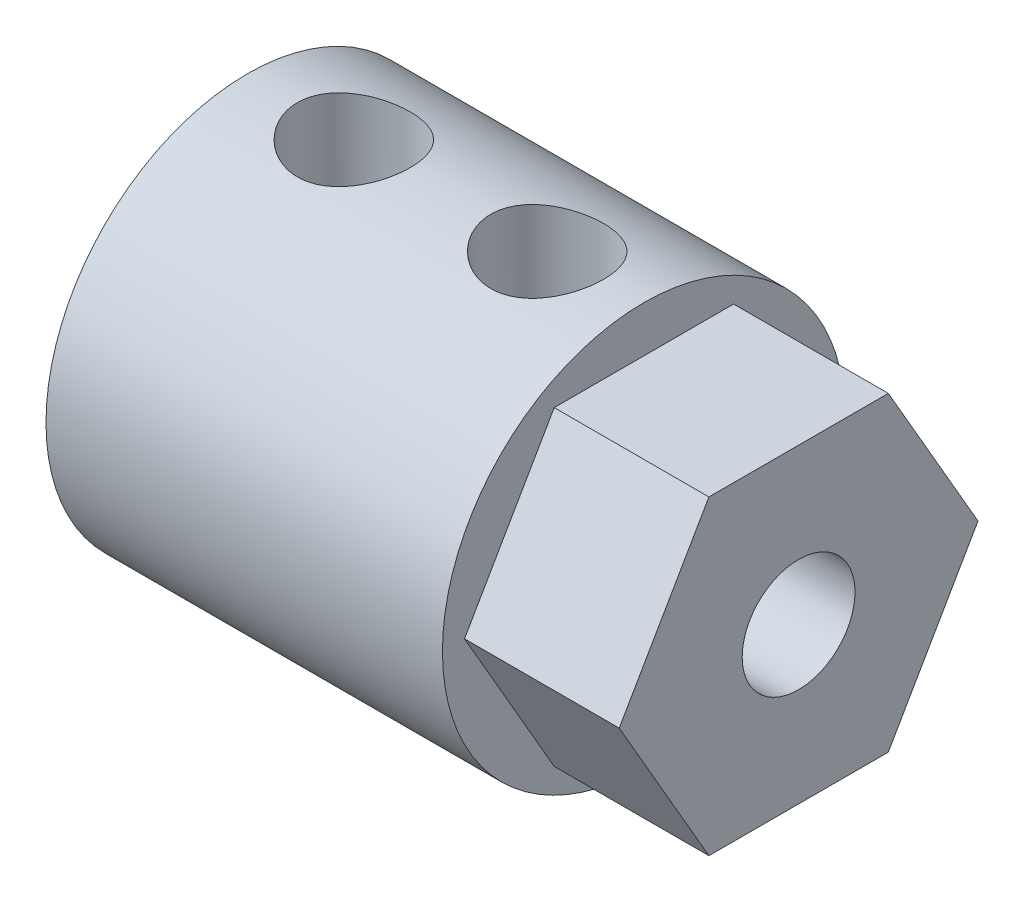
ISO-10303-21;
HEADER;
FILE_DESCRIPTION(('STEP AP214'),'2;1');
FILE_NAME('part.step','',(''),(''),'','','');
FILE_SCHEMA(('AUTOMOTIVE_DESIGN { 1 0 10303 214 1 1 1 1 }'));
ENDSEC;
DATA;
#1=APPLICATION_CONTEXT('core data for automotive mechanical design processes');
#2=APPLICATION_PROTOCOL_DEFINITION('international standard','automotive_design',2000,#1);
#3=PRODUCT_CONTEXT('',#1,'mechanical');
#4=PRODUCT('Part','Part','',(#3));
#5=PRODUCT_RELATED_PRODUCT_CATEGORY('part','',(#4));
#6=PRODUCT_DEFINITION_FORMATION('','',#4);
#7=PRODUCT_DEFINITION_CONTEXT('part definition',#1,'design');
#8=PRODUCT_DEFINITION('design','',#6,#7);
#9=PRODUCT_DEFINITION_SHAPE('','',#8);
#10=(LENGTH_UNIT() NAMED_UNIT(*) SI_UNIT(.MILLI.,.METRE.));
#11=(NAMED_UNIT(*) PLANE_ANGLE_UNIT() SI_UNIT($,.RADIAN.));
#12=(NAMED_UNIT(*) SI_UNIT($,.STERADIAN.) SOLID_ANGLE_UNIT());
#13=UNCERTAINTY_MEASURE_WITH_UNIT(LENGTH_MEASURE(1.E-05),#10,'distance_accuracy_value','');
#14=(GEOMETRIC_REPRESENTATION_CONTEXT(3) GLOBAL_UNCERTAINTY_ASSIGNED_CONTEXT((#13)) GLOBAL_UNIT_ASSIGNED_CONTEXT((#10,
#11,#12)) REPRESENTATION_CONTEXT('',''));
#15=CARTESIAN_POINT('',(0.,0.,0.));
#16=DIRECTION('',(0.,0.,1.));
#17=DIRECTION('',(1.,0.,0.));
#18=AXIS2_PLACEMENT_3D('',#15,#16,#17);
#19=CARTESIAN_POINT('',(-15.621,0.,0.));
#20=DIRECTION('',(1.,0.,0.));
#21=DIRECTION('',(0.,0.,-1.));
#22=AXIS2_PLACEMENT_3D('',#19,#20,#21);
#23=CYLINDRICAL_SURFACE('',#22,7.9375);
#24=CARTESIAN_POINT('',(-15.621,0.,0.));
#25=DIRECTION('',(-1.,0.,0.));
#26=DIRECTION('',(0.,0.,1.));
#27=AXIS2_PLACEMENT_3D('',#24,#25,#26);
#28=CIRCLE('',#27,7.9375);
#29=CARTESIAN_POINT('',(-15.621,0.,7.9375));
#30=VERTEX_POINT('',#29);
#31=EDGE_CURVE('E244',#30,#30,#28,.T.);
#32=ORIENTED_EDGE('',*,*,#31,.F.);
#33=EDGE_LOOP('',(#32));
#34=FACE_BOUND('',#33,.T.);
#35=CARTESIAN_POINT('',(0.,0.,0.));
#36=DIRECTION('',(-1.,0.,0.));
#37=DIRECTION('',(0.,0.,1.));
#38=AXIS2_PLACEMENT_3D('',#35,#36,#37);
#39=CIRCLE('',#38,7.9375);
#40=CARTESIAN_POINT('',(0.,0.,7.9375));
#41=VERTEX_POINT('',#40);
#42=EDGE_CURVE('E252',#41,#41,#39,.T.);
#43=ORIENTED_EDGE('',*,*,#42,.T.);
#44=EDGE_LOOP('',(#43));
#45=FACE_BOUND('',#44,.T.);
#46=CARTESIAN_POINT('',(-1.5875,7.9375,0.));
#47=CARTESIAN_POINT('',(-1.587502398111,7.93749841297143,-0.122289434384592));
#48=CARTESIAN_POINT('',(-1.59762687587564,7.93464640374844,-0.24460380457482));
#49=CARTESIAN_POINT('',(-1.63777621242458,7.92354674957216,-0.485694032880113));
#50=CARTESIAN_POINT('',(-1.66780922620723,7.91529689355351,-0.60446842009344));
#51=CARTESIAN_POINT('',(-1.74671141204331,7.89430957331477,-0.834964927090246));
#52=CARTESIAN_POINT('',(-1.79555492267656,7.88157822480584,-0.946696414251323));
#53=CARTESIAN_POINT('',(-1.91059251715217,7.85296472583047,-1.16038287672983));
#54=CARTESIAN_POINT('',(-1.97678821842334,7.83708228167832,-1.26233693946535));
#55=CARTESIAN_POINT('',(-2.12642117544705,7.8034232726709,-1.45615831068255));
#56=CARTESIAN_POINT('',(-2.21021716527189,7.78561177508401,-1.54774260219952));
#57=CARTESIAN_POINT('',(-2.39190611080195,7.75032012250063,-1.71575936348891));
#58=CARTESIAN_POINT('',(-2.48980108186053,7.73284001527906,-1.79218966338291));
#59=CARTESIAN_POINT('',(-2.69922041664797,7.6998283677456,-1.92915068426256));
#60=CARTESIAN_POINT('',(-2.81097026361879,7.68434065377252,-1.98934817384267));
#61=CARTESIAN_POINT('',(-3.04350943858364,7.65758432116579,-2.08998548271767));
#62=CARTESIAN_POINT('',(-3.16429690220516,7.64631483521622,-2.13042936410227));
#63=CARTESIAN_POINT('',(-3.4083305685353,7.62963290719132,-2.18941388458174));
#64=CARTESIAN_POINT('',(-3.53144225208111,7.62408261047198,-2.20847108866752));
#65=CARTESIAN_POINT('',(-3.77923081639445,7.61905627706929,-2.22575284029697));
#66=CARTESIAN_POINT('',(-3.90390736649889,7.61957897802232,-2.22398171731976));
#67=CARTESIAN_POINT('',(-4.14719088560424,7.62651666080719,-2.20006548936518));
#68=CARTESIAN_POINT('',(-4.26586618923935,7.63274845031214,-2.17855378119358));
#69=CARTESIAN_POINT('',(-4.49785161633767,7.65010764560777,-2.1167849227819));
#70=CARTESIAN_POINT('',(-4.61116127104343,7.66123547825911,-2.0765261380634));
#71=CARTESIAN_POINT('',(-4.83081036825138,7.68728817952527,-1.97790928071366));
#72=CARTESIAN_POINT('',(-4.93704749092035,7.7022578670799,-1.9193356539467));
#73=CARTESIAN_POINT('',(-5.13840348293651,7.73428447505437,-1.78590192518265));
#74=CARTESIAN_POINT('',(-5.23351995715069,7.75134184349961,-1.71103832459554));
#75=CARTESIAN_POINT('',(-5.41354369025916,7.78637689551321,-1.54394699344826));
#76=CARTESIAN_POINT('',(-5.49795804958312,7.80436556600566,-1.45118970763094));
#77=CARTESIAN_POINT('',(-5.6501397189066,7.83868636973626,-1.25261337987339));
#78=CARTESIAN_POINT('',(-5.71790623276662,7.85501842372916,-1.14679371362257));
#79=CARTESIAN_POINT('',(-5.83511680307549,7.88430398837012,-0.924282134935336));
#80=CARTESIAN_POINT('',(-5.88446390275543,7.89723951739796,-0.807536626467184));
#81=CARTESIAN_POINT('',(-5.96268456648585,7.91814489748872,-0.566959944436843));
#82=CARTESIAN_POINT('',(-5.99156307940385,7.92611594879985,-0.443130491451456));
#83=CARTESIAN_POINT('',(-6.02723492193407,7.93600949314591,-0.196101124919305));
#84=CARTESIAN_POINT('',(-6.03469753237385,7.93811522289107,-0.0730050493447829));
#85=CARTESIAN_POINT('',(-6.02918471081962,7.93657184147866,0.172682576611987));
#86=CARTESIAN_POINT('',(-6.01621162593874,7.9329233912093,0.295274183312975));
#87=CARTESIAN_POINT('',(-5.97074190820065,7.92040063357283,0.534031051075131));
#88=CARTESIAN_POINT('',(-5.93862546036324,7.91162815516481,0.650274552968655));
#89=CARTESIAN_POINT('',(-5.85622831272659,7.88985924413703,0.875707417570524));
#90=CARTESIAN_POINT('',(-5.80594554945293,7.87686233168934,0.984895977260915));
#91=CARTESIAN_POINT('',(-5.68744786332019,7.84766549897653,1.19566699168485));
#92=CARTESIAN_POINT('',(-5.61887794200882,7.83140394678713,1.29704110514929));
#93=CARTESIAN_POINT('',(-5.46619270156045,7.79755361828553,1.48707642789286));
#94=CARTESIAN_POINT('',(-5.38207398796685,7.77996455266095,1.57573485369032));
#95=CARTESIAN_POINT('',(-5.19754542583976,7.74475574438945,1.74069277960931));
#96=CARTESIAN_POINT('',(-5.09670785802765,7.72715229446269,1.81651823498446));
#97=CARTESIAN_POINT('',(-4.88336192472095,7.69450550823917,1.95019062299679));
#98=CARTESIAN_POINT('',(-4.77085399552126,7.67946207629195,2.00803822741068));
#99=CARTESIAN_POINT('',(-4.53786166057827,7.65381415280244,2.10368464486661));
#100=CARTESIAN_POINT('',(-4.41742523518426,7.64318537493625,2.14159346282923));
#101=CARTESIAN_POINT('',(-4.17153384499789,7.62758676285093,2.19651019045085));
#102=CARTESIAN_POINT('',(-4.04608033702155,7.62261529808532,2.21352412253003));
#103=CARTESIAN_POINT('',(-3.79859578431933,7.61904009677965,2.22579634337424));
#104=CARTESIAN_POINT('',(-3.67660541699017,7.62021218162667,2.22182051126848));
#105=CARTESIAN_POINT('',(-3.43510880845293,7.6282616577072,2.19402262129698));
#106=CARTESIAN_POINT('',(-3.31560249051765,7.63513887245171,2.17020117735789));
#107=CARTESIAN_POINT('',(-3.08354127422839,7.65368348699787,2.10385266467513));
#108=CARTESIAN_POINT('',(-2.9709315866381,7.66530524566887,2.06150355593924));
#109=CARTESIAN_POINT('',(-2.75432773685296,7.69202662666681,1.95943946415649));
#110=CARTESIAN_POINT('',(-2.65033505215382,7.70712684374916,1.89972151088259));
#111=CARTESIAN_POINT('',(-2.45030033200027,7.73971061356866,1.76236009307517));
#112=CARTESIAN_POINT('',(-2.35462190181763,7.75725523110183,1.68420156559259));
#113=CARTESIAN_POINT('',(-2.17749007152221,7.79242812441293,1.51313678633054));
#114=CARTESIAN_POINT('',(-2.09604021868082,7.81005641993032,1.42022686792809));
#115=CARTESIAN_POINT('',(-1.9477194350652,7.84392363107764,1.21957214778867));
#116=CARTESIAN_POINT('',(-1.88125116374675,7.86011833953724,1.11152155583987));
#117=CARTESIAN_POINT('',(-1.76752470486395,7.88879340490492,0.885326940704654));
#118=CARTESIAN_POINT('',(-1.72025544990178,7.90127590062755,0.767188780236336));
#119=CARTESIAN_POINT('',(-1.65169956819758,7.91970568495603,0.541420338472193));
#120=CARTESIAN_POINT('',(-1.62768411699767,7.92632747266372,0.43466625717126));
#121=CARTESIAN_POINT('',(-1.59558423476692,7.93522507389311,0.218614550898743));
#122=CARTESIAN_POINT('',(-1.58749785627538,7.93750141868005,0.109317238511546));
#123=CARTESIAN_POINT('',(-1.5875,7.9375,0.));
#124=B_SPLINE_CURVE_WITH_KNOTS('',3,(#46,#47,#48,#49,#50,#51,#52,#53,#54,#55,#56,#57,#58,#59,
#60,#61,#62,#63,#64,#65,#66,#67,#68,#69,#70,#71,#72,#73,#74,#75,#76,#77,#78,#79,#80,#81,#82,#83,
#84,#85,#86,#87,#88,#89,#90,#91,#92,#93,#94,#95,#96,#97,#98,#99,#100,#101,#102,#103,#104,#105,
#106,#107,#108,#109,#110,#111,#112,#113,#114,#115,#116,#117,#118,#119,#120,#121,#122,#123),
.UNSPECIFIED.,.T.,.F.,(4,2,2,2,2,2,2,2,2,2,2,2,2,2,2,2,2,2,2,2,2,2,2,2,2,2,2,2,2,2,2,2,2,2,2,2,
2,2,4),(0.,0.366467159375124,0.733084525040348,1.09920351015625,1.46535663402202,
1.83985902232483,2.2144149964241,2.59615815397004,2.97782277758453,3.35005588802573,
3.72221162561857,4.08282869463252,4.44347721021375,4.80854112418707,5.1736835202881,
5.55201589839114,5.93036636572644,6.310681224658,6.69090410017637,7.05910769208849,
7.42726899757706,7.78835148351941,8.14947499698045,8.51819575160419,8.88699709692384,
9.26734918477582,9.64768705833693,10.0259039435842,10.4040117918163,10.7684207028235,
11.1328183412108,11.4937902180729,11.8548238606708,12.2274771315308,12.6002231749544,
12.9820329052775,13.3636222254502,13.6912554080105,14.0188485322216),.UNSPECIFIED.);
#125=CARTESIAN_POINT('',(-1.5875,7.9375,0.));
#126=VERTEX_POINT('',#125);
#127=EDGE_CURVE('E154',#126,#126,#124,.T.);
#128=ORIENTED_EDGE('',*,*,#127,.F.);
#129=EDGE_LOOP('',(#128));
#130=FACE_BOUND('',#129,.T.);
#131=CARTESIAN_POINT('',(-9.2075,7.9375,0.));
#132=CARTESIAN_POINT('',(-9.207502398111,7.93749841297143,-0.122289434384593));
#133=CARTESIAN_POINT('',(-9.21762687587564,7.93464640374844,-0.24460380457482));
#134=CARTESIAN_POINT('',(-9.25777621242458,7.92354674957216,-0.485694032880113));
#135=CARTESIAN_POINT('',(-9.28780922620723,7.91529689355351,-0.60446842009344));
#136=CARTESIAN_POINT('',(-9.36671141204331,7.89430957331477,-0.834964927090245));
#137=CARTESIAN_POINT('',(-9.41555492267656,7.88157822480584,-0.946696414251323));
#138=CARTESIAN_POINT('',(-9.53059251715217,7.85296472583047,-1.16038287672983));
#139=CARTESIAN_POINT('',(-9.59678821842334,7.83708228167832,-1.26233693946535));
#140=CARTESIAN_POINT('',(-9.74642117544705,7.8034232726709,-1.45615831068255));
#141=CARTESIAN_POINT('',(-9.83021716527189,7.78561177508401,-1.54774260219952));
#142=CARTESIAN_POINT('',(-10.0119061108019,7.75032012250063,-1.7157593634889));
#143=CARTESIAN_POINT('',(-10.1098010818605,7.73284001527906,-1.79218966338291));
#144=CARTESIAN_POINT('',(-10.319220416648,7.6998283677456,-1.92915068426256));
#145=CARTESIAN_POINT('',(-10.4309702636188,7.68434065377252,-1.98934817384266));
#146=CARTESIAN_POINT('',(-10.6635094385836,7.65758432116579,-2.08998548271767));
#147=CARTESIAN_POINT('',(-10.7842969022052,7.64631483521622,-2.13042936410227));
#148=CARTESIAN_POINT('',(-11.0283305685353,7.62963290719132,-2.18941388458174));
#149=CARTESIAN_POINT('',(-11.1514422520811,7.62408261047198,-2.20847108866752));
#150=CARTESIAN_POINT('',(-11.3992308163944,7.61905627706929,-2.22575284029697));
#151=CARTESIAN_POINT('',(-11.5239073664989,7.61957897802232,-2.22398171731976));
#152=CARTESIAN_POINT('',(-11.7671908856042,7.62651666080719,-2.20006548936518));
#153=CARTESIAN_POINT('',(-11.8858661892394,7.63274845031214,-2.17855378119358));
#154=CARTESIAN_POINT('',(-12.1178516163377,7.65010764560777,-2.1167849227819));
#155=CARTESIAN_POINT('',(-12.2311612710434,7.66123547825911,-2.0765261380634));
#156=CARTESIAN_POINT('',(-12.4508103682514,7.68728817952527,-1.97790928071366));
#157=CARTESIAN_POINT('',(-12.5570474909203,7.7022578670799,-1.9193356539467));
#158=CARTESIAN_POINT('',(-12.7584034829365,7.73428447505437,-1.78590192518265));
#159=CARTESIAN_POINT('',(-12.8535199571507,7.75134184349961,-1.71103832459554));
#160=CARTESIAN_POINT('',(-13.0335436902592,7.78637689551321,-1.54394699344827));
#161=CARTESIAN_POINT('',(-13.1179580495831,7.80436556600566,-1.45118970763094));
#162=CARTESIAN_POINT('',(-13.2701397189066,7.83868636973626,-1.25261337987339));
#163=CARTESIAN_POINT('',(-13.3379062327666,7.85501842372916,-1.14679371362257));
#164=CARTESIAN_POINT('',(-13.4551168030755,7.88430398837012,-0.924282134935336));
#165=CARTESIAN_POINT('',(-13.5044639027554,7.89723951739796,-0.807536626467184));
#166=CARTESIAN_POINT('',(-13.5826845664859,7.91814489748872,-0.566959944436844));
#167=CARTESIAN_POINT('',(-13.6115630794039,7.92611594879985,-0.443130491451456));
#168=CARTESIAN_POINT('',(-13.6472349219341,7.93600949314591,-0.196101124919305));
#169=CARTESIAN_POINT('',(-13.6546975323738,7.93811522289107,-0.0730050493447832));
#170=CARTESIAN_POINT('',(-13.6491847108196,7.93657184147866,0.172682576611986));
#171=CARTESIAN_POINT('',(-13.6362116259387,7.9329233912093,0.295274183312975));
#172=CARTESIAN_POINT('',(-13.5907419082007,7.92040063357283,0.534031051075131));
#173=CARTESIAN_POINT('',(-13.5586254603632,7.91162815516481,0.650274552968655));
#174=CARTESIAN_POINT('',(-13.4762283127266,7.88985924413703,0.875707417570524));
#175=CARTESIAN_POINT('',(-13.4259455494529,7.87686233168934,0.984895977260914));
#176=CARTESIAN_POINT('',(-13.3074478633202,7.84766549897653,1.19566699168485));
#177=CARTESIAN_POINT('',(-13.2388779420088,7.83140394678713,1.29704110514929));
#178=CARTESIAN_POINT('',(-13.0861927015605,7.79755361828553,1.48707642789286));
#179=CARTESIAN_POINT('',(-13.0020739879669,7.77996455266095,1.57573485369032));
#180=CARTESIAN_POINT('',(-12.8175454258398,7.74475574438945,1.74069277960931));
#181=CARTESIAN_POINT('',(-12.7167078580276,7.72715229446269,1.81651823498446));
#182=CARTESIAN_POINT('',(-12.5033619247209,7.69450550823917,1.95019062299679));
#183=CARTESIAN_POINT('',(-12.3908539955213,7.67946207629195,2.00803822741068));
#184=CARTESIAN_POINT('',(-12.1578616605783,7.65381415280244,2.10368464486661));
#185=CARTESIAN_POINT('',(-12.0374252351843,7.64318537493625,2.14159346282923));
#186=CARTESIAN_POINT('',(-11.7915338449979,7.62758676285093,2.19651019045085));
#187=CARTESIAN_POINT('',(-11.6660803370216,7.62261529808532,2.21352412253003));
#188=CARTESIAN_POINT('',(-11.4185957843193,7.61904009677965,2.22579634337424));
#189=CARTESIAN_POINT('',(-11.2966054169902,7.62021218162667,2.22182051126848));
#190=CARTESIAN_POINT('',(-11.0551088084529,7.6282616577072,2.19402262129698));
#191=CARTESIAN_POINT('',(-10.9356024905177,7.63513887245171,2.17020117735789));
#192=CARTESIAN_POINT('',(-10.7035412742284,7.65368348699787,2.10385266467513));
#193=CARTESIAN_POINT('',(-10.5909315866381,7.66530524566887,2.06150355593924));
#194=CARTESIAN_POINT('',(-10.374327736853,7.69202662666681,1.95943946415649));
#195=CARTESIAN_POINT('',(-10.2703350521538,7.70712684374916,1.89972151088259));
#196=CARTESIAN_POINT('',(-10.0703003320003,7.73971061356866,1.76236009307517));
#197=CARTESIAN_POINT('',(-9.97462190181763,7.75725523110183,1.68420156559259));
#198=CARTESIAN_POINT('',(-9.79749007152221,7.79242812441293,1.51313678633054));
#199=CARTESIAN_POINT('',(-9.71604021868082,7.81005641993032,1.42022686792809));
#200=CARTESIAN_POINT('',(-9.5677194350652,7.84392363107764,1.21957214778867));
#201=CARTESIAN_POINT('',(-9.50125116374675,7.86011833953724,1.11152155583987));
#202=CARTESIAN_POINT('',(-9.38752470486395,7.88879340490492,0.885326940704655));
#203=CARTESIAN_POINT('',(-9.34025544990178,7.90127590062755,0.767188780236337));
#204=CARTESIAN_POINT('',(-9.27169956819758,7.91970568495603,0.541420338472194));
#205=CARTESIAN_POINT('',(-9.24768411699767,7.92632747266372,0.434666257171261));
#206=CARTESIAN_POINT('',(-9.21558423476692,7.93522507389311,0.218614550898744));
#207=CARTESIAN_POINT('',(-9.20749785627538,7.93750141868005,0.109317238511547));
#208=CARTESIAN_POINT('',(-9.2075,7.9375,0.));
#209=B_SPLINE_CURVE_WITH_KNOTS('',3,(#131,#132,#133,#134,#135,#136,#137,#138,#139,#140,#141,
#142,#143,#144,#145,#146,#147,#148,#149,#150,#151,#152,#153,#154,#155,#156,#157,#158,#159,#160,
#161,#162,#163,#164,#165,#166,#167,#168,#169,#170,#171,#172,#173,#174,#175,#176,#177,#178,#179,
#180,#181,#182,#183,#184,#185,#186,#187,#188,#189,#190,#191,#192,#193,#194,#195,#196,#197,#198,
#199,#200,#201,#202,#203,#204,#205,#206,#207,#208),.UNSPECIFIED.,.T.,.F.,(4,2,2,2,2,2,2,2,2,2,2,
2,2,2,2,2,2,2,2,2,2,2,2,2,2,2,2,2,2,2,2,2,2,2,2,2,2,2,4),(0.,0.366467159375124,
0.733084525040348,1.09920351015625,1.46535663402202,1.83985902232483,2.2144149964241,
2.59615815397004,2.97782277758453,3.35005588802573,3.72221162561857,4.08282869463252,
4.44347721021375,4.80854112418707,5.1736835202881,5.55201589839114,5.93036636572644,
6.310681224658,6.69090410017637,7.05910769208849,7.42726899757706,7.78835148351941,
8.14947499698045,8.51819575160419,8.88699709692384,9.26734918477582,9.64768705833692,
10.0259039435842,10.4040117918163,10.7684207028235,11.1328183412108,11.4937902180729,
11.8548238606708,12.2274771315308,12.6002231749544,12.9820329052775,13.3636222254502,
13.6912554080105,14.0188485322216),.UNSPECIFIED.);
#210=CARTESIAN_POINT('',(-9.2075,7.9375,0.));
#211=VERTEX_POINT('',#210);
#212=EDGE_CURVE('E179',#211,#211,#209,.T.);
#213=ORIENTED_EDGE('',*,*,#212,.F.);
#214=EDGE_LOOP('',(#213));
#215=FACE_BOUND('',#214,.T.);
#216=ADVANCED_FACE('F47',(#34,#45,#130,#215),#23,.T.);
#217=CARTESIAN_POINT('',(-15.621,0.,0.));
#218=DIRECTION('',(1.,0.,0.));
#219=DIRECTION('',(0.,0.,-1.));
#220=AXIS2_PLACEMENT_3D('',#217,#218,#219);
#221=CYLINDRICAL_SURFACE('',#220,3.2639);
#222=CARTESIAN_POINT('',(-3.81,2.39030060034298,-2.2225));
#223=CARTESIAN_POINT('',(-3.86387681861353,2.39029751716212,-2.22250164306595));
#224=CARTESIAN_POINT('',(-3.91773845668203,2.39213071298594,-2.22053678683314));
#225=CARTESIAN_POINT('',(-4.02494702809361,2.39934857483477,-2.21273503878008));
#226=CARTESIAN_POINT('',(-4.07829381339239,2.4047342332002,-2.2068970650454));
#227=CARTESIAN_POINT('',(-4.23699002756019,2.42588326346957,-2.18371102633077));
#228=CARTESIAN_POINT('',(-4.34090732766237,2.44663804441049,-2.16069112531605));
#229=CARTESIAN_POINT('',(-4.5409605126561,2.49769801818942,-2.1014344738383));
#230=CARTESIAN_POINT('',(-4.63716510134079,2.52790338207168,-2.06533528073356));
#231=CARTESIAN_POINT('',(-4.82199185747863,2.59426863384097,-1.98133330962816));
#232=CARTESIAN_POINT('',(-4.91061293079026,2.63042937877029,-1.93342883222908));
#233=CARTESIAN_POINT('',(-5.09362032816993,2.71171973668246,-1.81806779220596));
#234=CARTESIAN_POINT('',(-5.18657569992676,2.75734854327609,-1.74869430189853));
#235=CARTESIAN_POINT('',(-5.3607914885878,2.84832951759792,-1.59623415100642));
#236=CARTESIAN_POINT('',(-5.44203851577277,2.89368131268224,-1.5131320196709));
#237=CARTESIAN_POINT('',(-5.60295900772415,2.98719173096089,-1.32019416449024));
#238=CARTESIAN_POINT('',(-5.68046893060544,3.03470940930687,-1.2082125628379));
#239=CARTESIAN_POINT('',(-5.81482049963141,3.11931496425914,-0.968977638102178));
#240=CARTESIAN_POINT('',(-5.87170082899154,3.15642233165939,-0.841753499280781));
#241=CARTESIAN_POINT('',(-5.94968186708383,3.20798497031896,-0.610037351910737));
#242=CARTESIAN_POINT('',(-5.97622201597288,3.22581145431039,-0.508112525674404));
#243=CARTESIAN_POINT('',(-6.01463822381124,3.25173183658252,-0.30034638065822));
#244=CARTESIAN_POINT('',(-6.0265255990578,3.2598332453858,-0.194508149342579));
#245=CARTESIAN_POINT('',(-6.03497838669641,3.26558670252435,0.0182487258031895));
#246=CARTESIAN_POINT('',(-6.03151751530509,3.26322082571014,0.125168909922686));
#247=CARTESIAN_POINT('',(-6.00942165359198,3.24821918218687,0.336698894486105));
#248=CARTESIAN_POINT('',(-5.99078222924205,3.23558041451607,0.44130801063722));
#249=CARTESIAN_POINT('',(-5.9398295096798,3.20146247619827,0.643429241760701));
#250=CARTESIAN_POINT('',(-5.90777927436546,3.18015358541928,0.741037675775122));
#251=CARTESIAN_POINT('',(-5.83143327006727,3.13031864942995,0.929325463827257));
#252=CARTESIAN_POINT('',(-5.78713517056554,3.10179123076919,1.02000349495551));
#253=CARTESIAN_POINT('',(-5.68210832485672,3.03586328663528,1.20293986056559));
#254=CARTESIAN_POINT('',(-5.62009047445614,2.99782509199416,1.29422452830014));
#255=CARTESIAN_POINT('',(-5.4842734004816,2.91782698130799,1.46570906304054));
#256=CARTESIAN_POINT('',(-5.41046064806107,2.87586258507,1.54589600135202));
#257=CARTESIAN_POINT('',(-5.23880503297432,2.78368336992229,1.70709018645584));
#258=CARTESIAN_POINT('',(-5.13901027469807,2.73327894501512,1.78591862722644));
#259=CARTESIAN_POINT('',(-4.92610956542356,2.63633546062852,1.92614467823464));
#260=CARTESIAN_POINT('',(-4.8130105732286,2.58979440194658,1.98755134411938));
#261=CARTESIAN_POINT('',(-4.60287409551625,2.51692976605818,2.07862319301861));
#262=CARTESIAN_POINT('',(-4.50836901885494,2.48842814486749,2.11236098791731));
#263=CARTESIAN_POINT('',(-4.31350321206215,2.44093738649646,2.16706984520766));
#264=CARTESIAN_POINT('',(-4.21315361484031,2.4219307843843,2.18806436272226));
#265=CARTESIAN_POINT('',(-4.00800115894879,2.39631941762942,2.21609711209024));
#266=CARTESIAN_POINT('',(-3.90316802929383,2.38981991348072,2.22301691777719));
#267=CARTESIAN_POINT('',(-3.69364554010754,2.39083751520441,2.22192260819448));
#268=CARTESIAN_POINT('',(-3.58895617793243,2.39835435977746,2.21390877132478));
#269=CARTESIAN_POINT('',(-3.39534714993433,2.42431464368734,2.18541503596635));
#270=CARTESIAN_POINT('',(-3.30600055922041,2.44139896573962,2.16647827759457));
#271=CARTESIAN_POINT('',(-3.13193124323293,2.48317543867991,2.11846510552193));
#272=CARTESIAN_POINT('',(-3.04721291860546,2.50787468672347,2.08937922943731));
#273=CARTESIAN_POINT('',(-2.84602577341292,2.5748995454653,2.00671051110969));
#274=CARTESIAN_POINT('',(-2.73262986598745,2.62013386390762,1.94800221309072));
#275=CARTESIAN_POINT('',(-2.51865038105588,2.71512442704127,1.81327308538944));
#276=CARTESIAN_POINT('',(-2.41809125671433,2.76488900163698,1.7372199605789));
#277=CARTESIAN_POINT('',(-2.22960819170821,2.86438428060038,1.56784544891095));
#278=CARTESIAN_POINT('',(-2.14188732809697,2.91410415173744,1.47429089917192));
#279=CARTESIAN_POINT('',(-1.98284649256078,3.00797601331659,1.27182262198244));
#280=CARTESIAN_POINT('',(-1.91150080442577,3.05213668420089,1.16293341673665));
#281=CARTESIAN_POINT('',(-1.79870992576815,3.12366488597408,0.951800831739676));
#282=CARTESIAN_POINT('',(-1.75421733057617,3.1526187359081,0.851727756736225));
#283=CARTESIAN_POINT('',(-1.68004093773573,3.20148086126667,0.644130252923867));
#284=CARTESIAN_POINT('',(-1.65034767665006,3.22139491646099,0.53661063604242));
#285=CARTESIAN_POINT('',(-1.60725477041928,3.25044100717349,0.316332971593631));
#286=CARTESIAN_POINT('',(-1.5939353468613,3.25951995112598,0.203551920591964));
#287=CARTESIAN_POINT('',(-1.58473117240477,3.26578394435276,-0.0230473007282234));
#288=CARTESIAN_POINT('',(-1.5888424303553,3.26297171638166,-0.136865227675214));
#289=CARTESIAN_POINT('',(-1.61315228406288,3.24647655831156,-0.352356081485915));
#290=CARTESIAN_POINT('',(-1.63199964641102,3.23370692855918,-0.45425785621263));
#291=CARTESIAN_POINT('',(-1.68313948316801,3.19948628740756,-0.653080343731994));
#292=CARTESIAN_POINT('',(-1.71543474132803,3.17803347859227,-0.750000020547386));
#293=CARTESIAN_POINT('',(-1.79400328334478,3.12679526171725,-0.9415468883208));
#294=CARTESIAN_POINT('',(-1.84088824978863,3.09665058725049,-1.03582433338721));
#295=CARTESIAN_POINT('',(-1.94634087831189,3.0306881826343,-1.2153736697172));
#296=CARTESIAN_POINT('',(-2.00491141445185,2.99486905730355,-1.30064333761535));
#297=CARTESIAN_POINT('',(-2.14242220796437,2.91389475700256,-1.47404175906904));
#298=CARTESIAN_POINT('',(-2.22311796319132,2.86815787793437,-1.56050331391021));
#299=CARTESIAN_POINT('',(-2.39706599510535,2.77569222982111,-1.71960778163205));
#300=CARTESIAN_POINT('',(-2.49034607990893,2.72896146285769,-1.79221920625993));
#301=CARTESIAN_POINT('',(-2.64543245235382,2.65843375448745,-1.89414779256364));
#302=CARTESIAN_POINT('',(-2.70338861081746,2.63346416446701,-1.92860177819981));
#303=CARTESIAN_POINT('',(-2.82288433259694,2.58552432263349,-1.99240982757592));
#304=CARTESIAN_POINT('',(-2.88442493443367,2.5625546551155,-2.02176240337211));
#305=CARTESIAN_POINT('',(-3.01063249425583,2.51972580178605,-2.07489455039068));
#306=CARTESIAN_POINT('',(-3.07528731929103,2.49985564954387,-2.09869392488008));
#307=CARTESIAN_POINT('',(-3.20752239176595,2.46423799418168,-2.14040351899111));
#308=CARTESIAN_POINT('',(-3.27509996719961,2.44848681456931,-2.15831899411596));
#309=CARTESIAN_POINT('',(-3.41955893246682,2.42084169414365,-2.18930308664168));
#310=CARTESIAN_POINT('',(-3.49669293452559,2.40949428441096,-2.20170389939372));
#311=CARTESIAN_POINT('',(-3.65256269209018,2.39422803151017,-2.21829890001868));
#312=CARTESIAN_POINT('',(-3.73129754287663,2.39030510420782,-2.22249759983364));
#313=CARTESIAN_POINT('',(-3.81,2.39030060034298,-2.2225));
#314=B_SPLINE_CURVE_WITH_KNOTS('',3,(#222,#223,#224,#225,#226,#227,#228,#229,#230,#231,#232,
#233,#234,#235,#236,#237,#238,#239,#240,#241,#242,#243,#244,#245,#246,#247,#248,#249,#250,#251,
#252,#253,#254,#255,#256,#257,#258,#259,#260,#261,#262,#263,#264,#265,#266,#267,#268,#269,#270,
#271,#272,#273,#274,#275,#276,#277,#278,#279,#280,#281,#282,#283,#284,#285,#286,#287,#288,#289,
#290,#291,#292,#293,#294,#295,#296,#297,#298,#299,#300,#301,#302,#303,#304,#305,#306,#307,#308,
#309,#310,#311,#312,#313),.UNSPECIFIED.,.T.,.F.,(4,2,2,2,2,2,2,2,2,2,2,2,2,2,2,2,2,2,2,2,2,2,2,
2,2,2,2,2,2,2,2,2,2,2,2,2,2,2,2,2,2,2,2,2,2,4),(0.,0.161533348948191,0.323111839539057,
0.646528362355942,0.966637754458413,1.28679325400589,1.65935660879822,2.03234270402694,
2.46268949816965,2.89222511133065,3.21130654066329,3.53014138956571,3.84952245193868,
4.16899684684796,4.48247838740756,4.79601961818765,5.14489759350476,5.49417864560801,
5.90284878139955,6.31130610412828,6.62310792785091,6.93433409872721,7.24816830500536,
7.56199666069789,7.83965668809895,8.11757628258677,8.52183015265019,8.92684295725393,
9.33769520708225,9.74789775517685,10.0863332118707,10.4245519773946,10.7644212834151,
11.1042127728326,11.4160516092429,11.7279550292592,12.0552659049741,12.3826573821097,
12.7616441620906,13.141482557887,13.3569334403355,13.5724470589203,13.7871799698808,
14.001720556292,14.2378159869043,14.4737815059671),.UNSPECIFIED.);
#315=CARTESIAN_POINT('',(-3.81,2.39030060034298,-2.2225));
#316=VERTEX_POINT('',#315);
#317=EDGE_CURVE('E147',#316,#316,#314,.T.);
#318=ORIENTED_EDGE('',*,*,#317,.T.);
#319=EDGE_LOOP('',(#318));
#320=FACE_BOUND('',#319,.T.);
#321=CARTESIAN_POINT('',(-15.621,0.,0.));
#322=DIRECTION('',(-1.,0.,0.));
#323=DIRECTION('',(0.,0.,1.));
#324=AXIS2_PLACEMENT_3D('',#321,#322,#323);
#325=CIRCLE('',#324,3.2639);
#326=CARTESIAN_POINT('',(-15.621,0.,3.2639));
#327=VERTEX_POINT('',#326);
#328=EDGE_CURVE('E256',#327,#327,#325,.T.);
#329=ORIENTED_EDGE('',*,*,#328,.T.);
#330=EDGE_LOOP('',(#329));
#331=FACE_BOUND('',#330,.T.);
#332=CARTESIAN_POINT('',(0.,0.,0.));
#333=DIRECTION('',(-1.,0.,0.));
#334=DIRECTION('',(0.,0.,1.));
#335=AXIS2_PLACEMENT_3D('',#332,#333,#334);
#336=CIRCLE('',#335,3.2639);
#337=CARTESIAN_POINT('',(0.,0.,3.2639));
#338=VERTEX_POINT('',#337);
#339=EDGE_CURVE('E11',#338,#338,#336,.F.);
#340=ORIENTED_EDGE('',*,*,#339,.T.);
#341=EDGE_LOOP('',(#340));
#342=FACE_BOUND('',#341,.T.);
#343=CARTESIAN_POINT('',(-11.43,2.39030060034298,-2.2225));
#344=CARTESIAN_POINT('',(-11.4838768186135,2.39029751716212,-2.22250164306595));
#345=CARTESIAN_POINT('',(-11.537738456682,2.39213071298594,-2.22053678683314));
#346=CARTESIAN_POINT('',(-11.6449470280936,2.39934857483477,-2.21273503878008));
#347=CARTESIAN_POINT('',(-11.6982938133924,2.4047342332002,-2.2068970650454));
#348=CARTESIAN_POINT('',(-11.8569900275602,2.42588326346957,-2.18371102633077));
#349=CARTESIAN_POINT('',(-11.9609073276624,2.44663804441049,-2.16069112531605));
#350=CARTESIAN_POINT('',(-12.1609605126561,2.49769801818942,-2.1014344738383));
#351=CARTESIAN_POINT('',(-12.2571651013408,2.52790338207168,-2.06533528073356));
#352=CARTESIAN_POINT('',(-12.4419918574786,2.59426863384097,-1.98133330962816));
#353=CARTESIAN_POINT('',(-12.5306129307903,2.63042937877029,-1.93342883222908));
#354=CARTESIAN_POINT('',(-12.7136203281699,2.71171973668246,-1.81806779220596));
#355=CARTESIAN_POINT('',(-12.8065756999268,2.75734854327609,-1.74869430189853));
#356=CARTESIAN_POINT('',(-12.9807914885878,2.84832951759792,-1.59623415100642));
#357=CARTESIAN_POINT('',(-13.0620385157728,2.89368131268224,-1.5131320196709));
#358=CARTESIAN_POINT('',(-13.2229590077241,2.98719173096089,-1.32019416449024));
#359=CARTESIAN_POINT('',(-13.3004689306054,3.03470940930687,-1.2082125628379));
#360=CARTESIAN_POINT('',(-13.4348204996314,3.11931496425913,-0.96897763810218));
#361=CARTESIAN_POINT('',(-13.4917008289915,3.15642233165939,-0.841753499280783));
#362=CARTESIAN_POINT('',(-13.5696818670838,3.20798497031896,-0.61003735191074));
#363=CARTESIAN_POINT('',(-13.5962220159729,3.22581145431039,-0.508112525674407));
#364=CARTESIAN_POINT('',(-13.6346382238112,3.25173183658252,-0.300346380658223));
#365=CARTESIAN_POINT('',(-13.6465255990578,3.2598332453858,-0.194508149342582));
#366=CARTESIAN_POINT('',(-13.6549783866964,3.26558670252435,0.0182487258031864));
#367=CARTESIAN_POINT('',(-13.6515175153051,3.26322082571014,0.125168909922682));
#368=CARTESIAN_POINT('',(-13.629421653592,3.24821918218687,0.336698894486102));
#369=CARTESIAN_POINT('',(-13.6107822292421,3.23558041451607,0.441308010637217));
#370=CARTESIAN_POINT('',(-13.5598295096798,3.20146247619827,0.643429241760698));
#371=CARTESIAN_POINT('',(-13.5277792743655,3.18015358541928,0.741037675775119));
#372=CARTESIAN_POINT('',(-13.4514332700673,3.13031864942995,0.929325463827254));
#373=CARTESIAN_POINT('',(-13.4071351705655,3.10179123076919,1.02000349495551));
#374=CARTESIAN_POINT('',(-13.3021083248567,3.03586328663528,1.20293986056559));
#375=CARTESIAN_POINT('',(-13.2400904744561,2.99782509199416,1.29422452830014));
#376=CARTESIAN_POINT('',(-13.1042734004816,2.91782698130799,1.46570906304054));
#377=CARTESIAN_POINT('',(-13.0304606480611,2.87586258507,1.54589600135202));
#378=CARTESIAN_POINT('',(-12.8588050329743,2.7836833699223,1.70709018645583));
#379=CARTESIAN_POINT('',(-12.7590102746981,2.73327894501512,1.78591862722644));
#380=CARTESIAN_POINT('',(-12.5461095654236,2.63633546062852,1.92614467823464));
#381=CARTESIAN_POINT('',(-12.4330105732286,2.58979440194658,1.98755134411938));
#382=CARTESIAN_POINT('',(-12.2228740955163,2.51692976605818,2.07862319301861));
#383=CARTESIAN_POINT('',(-12.1283690188549,2.48842814486749,2.11236098791731));
#384=CARTESIAN_POINT('',(-11.9335032120622,2.44093738649647,2.16706984520766));
#385=CARTESIAN_POINT('',(-11.8331536148403,2.4219307843843,2.18806436272226));
#386=CARTESIAN_POINT('',(-11.6280011589488,2.39631941762942,2.21609711209024));
#387=CARTESIAN_POINT('',(-11.5231680292938,2.38981991348073,2.22301691777719));
#388=CARTESIAN_POINT('',(-11.3136455401075,2.39083751520441,2.22192260819448));
#389=CARTESIAN_POINT('',(-11.2089561779324,2.39835435977746,2.21390877132478));
#390=CARTESIAN_POINT('',(-11.0153471499343,2.42431464368734,2.18541503596635));
#391=CARTESIAN_POINT('',(-10.9260005592204,2.44139896573962,2.16647827759457));
#392=CARTESIAN_POINT('',(-10.7519312432329,2.48317543867991,2.11846510552193));
#393=CARTESIAN_POINT('',(-10.6672129186055,2.50787468672347,2.08937922943731));
#394=CARTESIAN_POINT('',(-10.4660257734129,2.5748995454653,2.00671051110969));
#395=CARTESIAN_POINT('',(-10.3526298659874,2.62013386390762,1.94800221309072));
#396=CARTESIAN_POINT('',(-10.1386503810559,2.71512442704127,1.81327308538944));
#397=CARTESIAN_POINT('',(-10.0380912567143,2.76488900163698,1.7372199605789));
#398=CARTESIAN_POINT('',(-9.84960819170821,2.86438428060038,1.56784544891095));
#399=CARTESIAN_POINT('',(-9.76188732809697,2.91410415173744,1.47429089917192));
#400=CARTESIAN_POINT('',(-9.60284649256078,3.00797601331659,1.27182262198243));
#401=CARTESIAN_POINT('',(-9.53150080442577,3.05213668420089,1.16293341673665));
#402=CARTESIAN_POINT('',(-9.41870992576815,3.12366488597408,0.951800831739675));
#403=CARTESIAN_POINT('',(-9.37421733057617,3.1526187359081,0.851727756736224));
#404=CARTESIAN_POINT('',(-9.30004093773572,3.20148086126667,0.644130252923866));
#405=CARTESIAN_POINT('',(-9.27034767665006,3.22139491646099,0.53661063604242));
#406=CARTESIAN_POINT('',(-9.22725477041928,3.25044100717349,0.316332971593631));
#407=CARTESIAN_POINT('',(-9.2139353468613,3.25951995112598,0.203551920591964));
#408=CARTESIAN_POINT('',(-9.20473117240477,3.26578394435276,-0.0230473007282238));
#409=CARTESIAN_POINT('',(-9.2088424303553,3.26297171638166,-0.136865227675214));
#410=CARTESIAN_POINT('',(-9.23315228406288,3.24647655831156,-0.352356081485914));
#411=CARTESIAN_POINT('',(-9.25199964641102,3.23370692855918,-0.454257856212629));
#412=CARTESIAN_POINT('',(-9.30313948316801,3.19948628740756,-0.653080343731993));
#413=CARTESIAN_POINT('',(-9.33543474132803,3.17803347859227,-0.750000020547385));
#414=CARTESIAN_POINT('',(-9.41400328334478,3.12679526171725,-0.9415468883208));
#415=CARTESIAN_POINT('',(-9.46088824978863,3.09665058725049,-1.03582433338721));
#416=CARTESIAN_POINT('',(-9.56634087831189,3.0306881826343,-1.2153736697172));
#417=CARTESIAN_POINT('',(-9.62491141445185,2.99486905730355,-1.30064333761535));
#418=CARTESIAN_POINT('',(-9.76242220796437,2.91389475700256,-1.47404175906904));
#419=CARTESIAN_POINT('',(-9.84311796319132,2.86815787793437,-1.56050331391021));
#420=CARTESIAN_POINT('',(-10.0170659951054,2.77569222982111,-1.71960778163205));
#421=CARTESIAN_POINT('',(-10.1103460799089,2.72896146285769,-1.79221920625993));
#422=CARTESIAN_POINT('',(-10.2654324523538,2.65843375448745,-1.89414779256364));
#423=CARTESIAN_POINT('',(-10.3233886108175,2.63346416446701,-1.92860177819981));
#424=CARTESIAN_POINT('',(-10.4428843325969,2.58552432263349,-1.99240982757592));
#425=CARTESIAN_POINT('',(-10.5044249344337,2.5625546551155,-2.02176240337211));
#426=CARTESIAN_POINT('',(-10.6306324942558,2.51972580178605,-2.07489455039068));
#427=CARTESIAN_POINT('',(-10.695287319291,2.49985564954387,-2.09869392488008));
#428=CARTESIAN_POINT('',(-10.8275223917659,2.46423799418168,-2.14040351899111));
#429=CARTESIAN_POINT('',(-10.8950999671996,2.44848681456931,-2.15831899411596));
#430=CARTESIAN_POINT('',(-11.0395589324668,2.42084169414365,-2.18930308664168));
#431=CARTESIAN_POINT('',(-11.1166929345256,2.40949428441096,-2.20170389939372));
#432=CARTESIAN_POINT('',(-11.2725626920902,2.39422803151018,-2.21829890001868));
#433=CARTESIAN_POINT('',(-11.3512975428766,2.39030510420783,-2.22249759983364));
#434=CARTESIAN_POINT('',(-11.43,2.39030060034298,-2.2225));
#435=B_SPLINE_CURVE_WITH_KNOTS('',3,(#343,#344,#345,#346,#347,#348,#349,#350,#351,#352,#353,
#354,#355,#356,#357,#358,#359,#360,#361,#362,#363,#364,#365,#366,#367,#368,#369,#370,#371,#372,
#373,#374,#375,#376,#377,#378,#379,#380,#381,#382,#383,#384,#385,#386,#387,#388,#389,#390,#391,
#392,#393,#394,#395,#396,#397,#398,#399,#400,#401,#402,#403,#404,#405,#406,#407,#408,#409,#410,
#411,#412,#413,#414,#415,#416,#417,#418,#419,#420,#421,#422,#423,#424,#425,#426,#427,#428,#429,
#430,#431,#432,#433,#434),.UNSPECIFIED.,.T.,.F.,(4,2,2,2,2,2,2,2,2,2,2,2,2,2,2,2,2,2,2,2,2,2,2,
2,2,2,2,2,2,2,2,2,2,2,2,2,2,2,2,2,2,2,2,2,2,4),(0.,0.161533348948189,0.323111839539057,
0.64652836235594,0.966637754458412,1.28679325400589,1.65935660879822,2.03234270402694,
2.46268949816965,2.89222511133065,3.21130654066329,3.53014138956571,3.84952245193868,
4.16899684684796,4.48247838740756,4.79601961818765,5.14489759350476,5.49417864560801,
5.90284878139954,6.31130610412828,6.62310792785091,6.93433409872721,7.24816830500536,
7.56199666069788,7.83965668809894,8.11757628258677,8.52183015265019,8.92684295725393,
9.33769520708225,9.74789775517686,10.0863332118707,10.4245519773946,10.7644212834151,
11.1042127728326,11.4160516092429,11.7279550292592,12.0552659049741,12.3826573821097,
12.7616441620906,13.141482557887,13.3569334403355,13.5724470589203,13.7871799698808,
14.001720556292,14.2378159869043,14.4737815059671),.UNSPECIFIED.);
#436=CARTESIAN_POINT('',(-11.43,2.39030060034298,-2.2225));
#437=VERTEX_POINT('',#436);
#438=EDGE_CURVE('E51',#437,#437,#435,.T.);
#439=ORIENTED_EDGE('',*,*,#438,.T.);
#440=EDGE_LOOP('',(#439));
#441=FACE_BOUND('',#440,.T.);
#442=ADVANCED_FACE('F156',(#320,#331,#342,#441),#221,.F.);
#443=CARTESIAN_POINT('',(6.096,6.1214,3.53419193781738));
#444=DIRECTION('',(0.,-0.5,-0.866025403784439));
#445=DIRECTION('',(0.,0.866025403784439,-0.5));
#446=AXIS2_PLACEMENT_3D('',#443,#444,#445);
#447=PLANE('',#446);
#448=DIRECTION('',(0.,-0.866025403784439,0.5));
#449=VECTOR('',#448,1.);
#450=CARTESIAN_POINT('',(0.,6.1214,3.53419193781738));
#451=LINE('',#450,#449);
#452=CARTESIAN_POINT('',(0.,6.1214,3.53419193781738));
#453=VERTEX_POINT('',#452);
#454=CARTESIAN_POINT('',(0.,0.,7.06838387563475));
#455=VERTEX_POINT('',#454);
#456=EDGE_CURVE('E110',#453,#455,#451,.T.);
#457=ORIENTED_EDGE('',*,*,#456,.T.);
#458=DIRECTION('',(-1.,0.,0.));
#459=VECTOR('',#458,1.);
#460=CARTESIAN_POINT('',(6.096,0.,7.06838387563475));
#461=LINE('',#460,#459);
#462=CARTESIAN_POINT('',(6.096,0.,7.06838387563475));
#463=VERTEX_POINT('',#462);
#464=EDGE_CURVE('E63',#463,#455,#461,.T.);
#465=ORIENTED_EDGE('',*,*,#464,.F.);
#466=DIRECTION('',(0.,-0.866025403784439,0.5));
#467=VECTOR('',#466,1.);
#468=CARTESIAN_POINT('',(6.096,6.1214,3.53419193781738));
#469=LINE('',#468,#467);
#470=CARTESIAN_POINT('',(6.096,6.1214,3.53419193781738));
#471=VERTEX_POINT('',#470);
#472=EDGE_CURVE('E115',#471,#463,#469,.T.);
#473=ORIENTED_EDGE('',*,*,#472,.F.);
#474=DIRECTION('',(-1.,0.,0.));
#475=VECTOR('',#474,1.);
#476=CARTESIAN_POINT('',(6.096,6.1214,3.53419193781738));
#477=LINE('',#476,#475);
#478=EDGE_CURVE('E130',#471,#453,#477,.T.);
#479=ORIENTED_EDGE('',*,*,#478,.T.);
#480=EDGE_LOOP('',(#457,#465,#473,#479));
#481=FACE_BOUND('',#480,.T.);
#482=ADVANCED_FACE('F49',(#481),#447,.F.);
#483=CARTESIAN_POINT('',(6.096,-6.1214,3.53419193781738));
#484=DIRECTION('',(0.,0.5,-0.866025403784439));
#485=DIRECTION('',(0.,0.866025403784439,0.5));
#486=AXIS2_PLACEMENT_3D('',#483,#484,#485);
#487=PLANE('',#486);
#488=DIRECTION('',(0.,-0.866025403784439,-0.5));
#489=VECTOR('',#488,1.);
#490=CARTESIAN_POINT('',(0.,-6.1214,3.53419193781738));
#491=LINE('',#490,#489);
#492=CARTESIAN_POINT('',(0.,-6.1214,3.53419193781738));
#493=VERTEX_POINT('',#492);
#494=EDGE_CURVE('E218',#455,#493,#491,.T.);
#495=ORIENTED_EDGE('',*,*,#494,.T.);
#496=DIRECTION('',(-1.,0.,0.));
#497=VECTOR('',#496,1.);
#498=CARTESIAN_POINT('',(6.096,-6.1214,3.53419193781738));
#499=LINE('',#498,#497);
#500=CARTESIAN_POINT('',(6.096,-6.1214,3.53419193781738));
#501=VERTEX_POINT('',#500);
#502=EDGE_CURVE('E141',#501,#493,#499,.T.);
#503=ORIENTED_EDGE('',*,*,#502,.F.);
#504=DIRECTION('',(0.,-0.866025403784439,-0.5));
#505=VECTOR('',#504,1.);
#506=CARTESIAN_POINT('',(6.096,-6.1214,3.53419193781738));
#507=LINE('',#506,#505);
#508=EDGE_CURVE('E230',#463,#501,#507,.T.);
#509=ORIENTED_EDGE('',*,*,#508,.F.);
#510=ORIENTED_EDGE('',*,*,#464,.T.);
#511=EDGE_LOOP('',(#495,#503,#509,#510));
#512=FACE_BOUND('',#511,.T.);
#513=ADVANCED_FACE('F208',(#512),#487,.F.);
#514=CARTESIAN_POINT('',(6.096,-6.1214,3.53419193781738));
#515=DIRECTION('',(0.,1.,0.));
#516=DIRECTION('',(0.,0.,1.));
#517=AXIS2_PLACEMENT_3D('',#514,#515,#516);
#518=PLANE('',#517);
#519=DIRECTION('',(0.,0.,-1.));
#520=VECTOR('',#519,1.);
#521=CARTESIAN_POINT('',(0.,-6.1214,3.53419193781738));
#522=LINE('',#521,#520);
#523=CARTESIAN_POINT('',(0.,-6.1214,-3.53419193781738));
#524=VERTEX_POINT('',#523);
#525=EDGE_CURVE('E222',#493,#524,#522,.T.);
#526=ORIENTED_EDGE('',*,*,#525,.T.);
#527=DIRECTION('',(-1.,0.,0.));
#528=VECTOR('',#527,1.);
#529=CARTESIAN_POINT('',(6.096,-6.1214,-3.53419193781738));
#530=LINE('',#529,#528);
#531=CARTESIAN_POINT('',(6.096,-6.1214,-3.53419193781738));
#532=VERTEX_POINT('',#531);
#533=EDGE_CURVE('E134',#532,#524,#530,.T.);
#534=ORIENTED_EDGE('',*,*,#533,.F.);
#535=DIRECTION('',(0.,0.,-1.));
#536=VECTOR('',#535,1.);
#537=CARTESIAN_POINT('',(6.096,-6.1214,3.53419193781738));
#538=LINE('',#537,#536);
#539=EDGE_CURVE('E226',#501,#532,#538,.T.);
#540=ORIENTED_EDGE('',*,*,#539,.F.);
#541=ORIENTED_EDGE('',*,*,#502,.T.);
#542=EDGE_LOOP('',(#526,#534,#540,#541));
#543=FACE_BOUND('',#542,.T.);
#544=ADVANCED_FACE('F205',(#543),#518,.F.);
#545=CARTESIAN_POINT('',(6.096,-6.1214,-3.53419193781738));
#546=DIRECTION('',(0.,0.5,0.866025403784439));
#547=DIRECTION('',(0.,-0.866025403784439,0.5));
#548=AXIS2_PLACEMENT_3D('',#545,#546,#547);
#549=PLANE('',#548);
#550=DIRECTION('',(0.,0.866025403784439,-0.5));
#551=VECTOR('',#550,1.);
#552=CARTESIAN_POINT('',(0.,-6.1214,-3.53419193781738));
#553=LINE('',#552,#551);
#554=CARTESIAN_POINT('',(0.,0.,-7.06838387563475));
#555=VERTEX_POINT('',#554);
#556=EDGE_CURVE('E126',#524,#555,#553,.T.);
#557=ORIENTED_EDGE('',*,*,#556,.T.);
#558=DIRECTION('',(-1.,0.,0.));
#559=VECTOR('',#558,1.);
#560=CARTESIAN_POINT('',(6.096,0.,-7.06838387563475));
#561=LINE('',#560,#559);
#562=CARTESIAN_POINT('',(6.096,0.,-7.06838387563475));
#563=VERTEX_POINT('',#562);
#564=EDGE_CURVE('E124',#563,#555,#561,.T.);
#565=ORIENTED_EDGE('',*,*,#564,.F.);
#566=DIRECTION('',(0.,0.866025403784439,-0.5));
#567=VECTOR('',#566,1.);
#568=CARTESIAN_POINT('',(6.096,-6.1214,-3.53419193781738));
#569=LINE('',#568,#567);
#570=EDGE_CURVE('E229',#532,#563,#569,.T.);
#571=ORIENTED_EDGE('',*,*,#570,.F.);
#572=ORIENTED_EDGE('',*,*,#533,.T.);
#573=EDGE_LOOP('',(#557,#565,#571,#572));
#574=FACE_BOUND('',#573,.T.);
#575=ADVANCED_FACE('F202',(#574),#549,.F.);
#576=CARTESIAN_POINT('',(6.096,6.1214,-3.53419193781738));
#577=DIRECTION('',(0.,-0.5,0.866025403784439));
#578=DIRECTION('',(0.,-0.866025403784439,-0.5));
#579=AXIS2_PLACEMENT_3D('',#576,#577,#578);
#580=PLANE('',#579);
#581=DIRECTION('',(0.,0.866025403784439,0.5));
#582=VECTOR('',#581,1.);
#583=CARTESIAN_POINT('',(0.,6.1214,-3.53419193781738));
#584=LINE('',#583,#582);
#585=CARTESIAN_POINT('',(0.,6.1214,-3.53419193781738));
#586=VERTEX_POINT('',#585);
#587=EDGE_CURVE('E107',#555,#586,#584,.T.);
#588=ORIENTED_EDGE('',*,*,#587,.T.);
#589=DIRECTION('',(-1.,0.,0.));
#590=VECTOR('',#589,1.);
#591=CARTESIAN_POINT('',(6.096,6.1214,-3.53419193781738));
#592=LINE('',#591,#590);
#593=CARTESIAN_POINT('',(6.096,6.1214,-3.53419193781738));
#594=VERTEX_POINT('',#593);
#595=EDGE_CURVE('E122',#594,#586,#592,.T.);
#596=ORIENTED_EDGE('',*,*,#595,.F.);
#597=DIRECTION('',(0.,0.866025403784439,0.5));
#598=VECTOR('',#597,1.);
#599=CARTESIAN_POINT('',(6.096,6.1214,-3.53419193781738));
#600=LINE('',#599,#598);
#601=EDGE_CURVE('E234',#563,#594,#600,.T.);
#602=ORIENTED_EDGE('',*,*,#601,.F.);
#603=ORIENTED_EDGE('',*,*,#564,.T.);
#604=EDGE_LOOP('',(#588,#596,#602,#603));
#605=FACE_BOUND('',#604,.T.);
#606=ADVANCED_FACE('F120',(#605),#580,.F.);
#607=CARTESIAN_POINT('',(6.096,6.1214,3.53419193781738));
#608=DIRECTION('',(0.,-1.,0.));
#609=DIRECTION('',(0.,0.,-1.));
#610=AXIS2_PLACEMENT_3D('',#607,#608,#609);
#611=PLANE('',#610);
#612=DIRECTION('',(0.,0.,1.));
#613=VECTOR('',#612,1.);
#614=CARTESIAN_POINT('',(0.,6.1214,3.53419193781738));
#615=LINE('',#614,#613);
#616=EDGE_CURVE('E104',#586,#453,#615,.T.);
#617=ORIENTED_EDGE('',*,*,#616,.T.);
#618=ORIENTED_EDGE('',*,*,#478,.F.);
#619=DIRECTION('',(0.,0.,1.));
#620=VECTOR('',#619,1.);
#621=CARTESIAN_POINT('',(6.096,6.1214,3.53419193781738));
#622=LINE('',#621,#620);
#623=EDGE_CURVE('E71',#594,#471,#622,.T.);
#624=ORIENTED_EDGE('',*,*,#623,.F.);
#625=ORIENTED_EDGE('',*,*,#595,.T.);
#626=EDGE_LOOP('',(#617,#618,#624,#625));
#627=FACE_BOUND('',#626,.T.);
#628=ADVANCED_FACE('F128',(#627),#611,.F.);
#629=CARTESIAN_POINT('',(6.096,0.,0.));
#630=DIRECTION('',(-1.,0.,0.));
#631=DIRECTION('',(0.,0.,1.));
#632=AXIS2_PLACEMENT_3D('',#629,#630,#631);
#633=PLANE('',#632);
#634=CARTESIAN_POINT('',(6.096,0.,0.));
#635=DIRECTION('',(-1.,0.,0.));
#636=DIRECTION('',(0.,0.,1.));
#637=AXIS2_PLACEMENT_3D('',#634,#635,#636);
#638=CIRCLE('',#637,2.2225);
#639=CARTESIAN_POINT('',(6.096,0.,2.2225));
#640=VERTEX_POINT('',#639);
#641=EDGE_CURVE('E155',#640,#640,#638,.T.);
#642=ORIENTED_EDGE('',*,*,#641,.T.);
#643=EDGE_LOOP('',(#642));
#644=FACE_BOUND('',#643,.T.);
#645=ORIENTED_EDGE('',*,*,#472,.T.);
#646=ORIENTED_EDGE('',*,*,#508,.T.);
#647=ORIENTED_EDGE('',*,*,#539,.T.);
#648=ORIENTED_EDGE('',*,*,#570,.T.);
#649=ORIENTED_EDGE('',*,*,#601,.T.);
#650=ORIENTED_EDGE('',*,*,#623,.T.);
#651=EDGE_LOOP('',(#645,#646,#647,#648,#649,#650));
#652=FACE_BOUND('',#651,.T.);
#653=ADVANCED_FACE('F189',(#644,#652),#633,.F.);
#654=CARTESIAN_POINT('',(0.,0.,0.));
#655=DIRECTION('',(-1.,0.,0.));
#656=DIRECTION('',(0.,0.,1.));
#657=AXIS2_PLACEMENT_3D('',#654,#655,#656);
#658=PLANE('',#657);
#659=ORIENTED_EDGE('',*,*,#42,.F.);
#660=EDGE_LOOP('',(#659));
#661=FACE_BOUND('',#660,.T.);
#662=ORIENTED_EDGE('',*,*,#494,.F.);
#663=ORIENTED_EDGE('',*,*,#456,.F.);
#664=ORIENTED_EDGE('',*,*,#616,.F.);
#665=ORIENTED_EDGE('',*,*,#587,.F.);
#666=ORIENTED_EDGE('',*,*,#556,.F.);
#667=ORIENTED_EDGE('',*,*,#525,.F.);
#668=EDGE_LOOP('',(#662,#663,#664,#665,#666,#667));
#669=FACE_BOUND('',#668,.T.);
#670=ADVANCED_FACE('F106',(#661,#669),#658,.F.);
#671=CARTESIAN_POINT('',(-15.621,0.,0.));
#672=DIRECTION('',(-1.,0.,0.));
#673=DIRECTION('',(0.,0.,1.));
#674=AXIS2_PLACEMENT_3D('',#671,#672,#673);
#675=PLANE('',#674);
#676=ORIENTED_EDGE('',*,*,#31,.T.);
#677=EDGE_LOOP('',(#676));
#678=FACE_BOUND('',#677,.T.);
#679=ORIENTED_EDGE('',*,*,#328,.F.);
#680=EDGE_LOOP('',(#679));
#681=FACE_BOUND('',#680,.T.);
#682=ADVANCED_FACE('F196',(#678,#681),#675,.T.);
#683=CARTESIAN_POINT('',(0.,0.,0.));
#684=DIRECTION('',(-1.,0.,0.));
#685=DIRECTION('',(0.,0.,1.));
#686=AXIS2_PLACEMENT_3D('',#683,#684,#685);
#687=PLANE('',#686);
#688=CARTESIAN_POINT('',(0.,0.,0.));
#689=DIRECTION('',(-1.,0.,0.));
#690=DIRECTION('',(0.,0.,1.));
#691=AXIS2_PLACEMENT_3D('',#688,#689,#690);
#692=CIRCLE('',#691,2.2225);
#693=CARTESIAN_POINT('',(0.,0.,2.2225));
#694=VERTEX_POINT('',#693);
#695=EDGE_CURVE('E177',#694,#694,#692,.T.);
#696=ORIENTED_EDGE('',*,*,#695,.F.);
#697=EDGE_LOOP('',(#696));
#698=FACE_BOUND('',#697,.T.);
#699=ORIENTED_EDGE('',*,*,#339,.F.);
#700=EDGE_LOOP('',(#699));
#701=FACE_BOUND('',#700,.T.);
#702=ADVANCED_FACE('F163',(#698,#701),#687,.T.);
#703=CARTESIAN_POINT('',(-3.81,7.9375,0.));
#704=DIRECTION('',(0.,-1.,0.));
#705=DIRECTION('',(0.,0.,-1.));
#706=AXIS2_PLACEMENT_3D('',#703,#704,#705);
#707=CYLINDRICAL_SURFACE('',#706,2.2225);
#708=ORIENTED_EDGE('',*,*,#317,.F.);
#709=EDGE_LOOP('',(#708));
#710=FACE_BOUND('',#709,.T.);
#711=ORIENTED_EDGE('',*,*,#127,.T.);
#712=EDGE_LOOP('',(#711));
#713=FACE_BOUND('',#712,.T.);
#714=ADVANCED_FACE('F159',(#710,#713),#707,.F.);
#715=CARTESIAN_POINT('',(-11.43,7.9375,0.));
#716=DIRECTION('',(0.,-1.,0.));
#717=DIRECTION('',(0.,0.,-1.));
#718=AXIS2_PLACEMENT_3D('',#715,#716,#717);
#719=CYLINDRICAL_SURFACE('',#718,2.2225);
#720=ORIENTED_EDGE('',*,*,#438,.F.);
#721=EDGE_LOOP('',(#720));
#722=FACE_BOUND('',#721,.T.);
#723=ORIENTED_EDGE('',*,*,#212,.T.);
#724=EDGE_LOOP('',(#723));
#725=FACE_BOUND('',#724,.T.);
#726=ADVANCED_FACE('F162',(#722,#725),#719,.F.);
#727=CARTESIAN_POINT('',(6.096,0.,0.));
#728=DIRECTION('',(-1.,0.,0.));
#729=DIRECTION('',(0.,0.,1.));
#730=AXIS2_PLACEMENT_3D('',#727,#728,#729);
#731=CYLINDRICAL_SURFACE('',#730,2.2225);
#732=CARTESIAN_POINT('',(6.096,0.,2.2225));
#733=CARTESIAN_POINT('',(6.0325,0.,2.2225));
#734=CARTESIAN_POINT('',(5.969,0.,2.2225));
#735=CARTESIAN_POINT('',(5.842,0.,2.2225));
#736=CARTESIAN_POINT('',(5.7785,0.,2.2225));
#737=CARTESIAN_POINT('',(5.6515,0.,2.2225));
#738=CARTESIAN_POINT('',(5.588,0.,2.2225));
#739=CARTESIAN_POINT('',(5.461,0.,2.2225));
#740=CARTESIAN_POINT('',(5.3975,0.,2.2225));
#741=CARTESIAN_POINT('',(5.2705,0.,2.2225));
#742=CARTESIAN_POINT('',(5.207,0.,2.2225));
#743=CARTESIAN_POINT('',(5.08,0.,2.2225));
#744=CARTESIAN_POINT('',(5.0165,0.,2.2225));
#745=CARTESIAN_POINT('',(4.8895,0.,2.2225));
#746=CARTESIAN_POINT('',(4.826,0.,2.2225));
#747=CARTESIAN_POINT('',(4.699,0.,2.2225));
#748=CARTESIAN_POINT('',(4.6355,0.,2.2225));
#749=CARTESIAN_POINT('',(4.5085,0.,2.2225));
#750=CARTESIAN_POINT('',(4.445,0.,2.2225));
#751=CARTESIAN_POINT('',(4.318,0.,2.2225));
#752=CARTESIAN_POINT('',(4.2545,0.,2.2225));
#753=CARTESIAN_POINT('',(4.1275,0.,2.2225));
#754=CARTESIAN_POINT('',(4.064,0.,2.2225));
#755=CARTESIAN_POINT('',(3.937,0.,2.2225));
#756=CARTESIAN_POINT('',(3.8735,0.,2.2225));
#757=CARTESIAN_POINT('',(3.7465,0.,2.2225));
#758=CARTESIAN_POINT('',(3.683,0.,2.2225));
#759=CARTESIAN_POINT('',(3.556,0.,2.2225));
#760=CARTESIAN_POINT('',(3.4925,0.,2.2225));
#761=CARTESIAN_POINT('',(3.3655,0.,2.2225));
#762=CARTESIAN_POINT('',(3.302,0.,2.2225));
#763=CARTESIAN_POINT('',(3.175,0.,2.2225));
#764=CARTESIAN_POINT('',(3.1115,0.,2.2225));
#765=CARTESIAN_POINT('',(2.9845,0.,2.2225));
#766=CARTESIAN_POINT('',(2.921,0.,2.2225));
#767=CARTESIAN_POINT('',(2.794,0.,2.2225));
#768=CARTESIAN_POINT('',(2.7305,0.,2.2225));
#769=CARTESIAN_POINT('',(2.6035,0.,2.2225));
#770=CARTESIAN_POINT('',(2.54,0.,2.2225));
#771=CARTESIAN_POINT('',(2.413,0.,2.2225));
#772=CARTESIAN_POINT('',(2.3495,0.,2.2225));
#773=CARTESIAN_POINT('',(2.2225,0.,2.2225));
#774=CARTESIAN_POINT('',(2.159,0.,2.2225));
#775=CARTESIAN_POINT('',(2.032,0.,2.2225));
#776=CARTESIAN_POINT('',(1.9685,0.,2.2225));
#777=CARTESIAN_POINT('',(1.8415,0.,2.2225));
#778=CARTESIAN_POINT('',(1.778,0.,2.2225));
#779=CARTESIAN_POINT('',(1.651,0.,2.2225));
#780=CARTESIAN_POINT('',(1.5875,0.,2.2225));
#781=CARTESIAN_POINT('',(1.4605,0.,2.2225));
#782=CARTESIAN_POINT('',(1.397,0.,2.2225));
#783=CARTESIAN_POINT('',(1.27,0.,2.2225));
#784=CARTESIAN_POINT('',(1.2065,0.,2.2225));
#785=CARTESIAN_POINT('',(1.0795,0.,2.2225));
#786=CARTESIAN_POINT('',(1.016,0.,2.2225));
#787=CARTESIAN_POINT('',(0.889,0.,2.2225));
#788=CARTESIAN_POINT('',(0.8255,0.,2.2225));
#789=CARTESIAN_POINT('',(0.6985,0.,2.2225));
#790=CARTESIAN_POINT('',(0.635,0.,2.2225));
#791=CARTESIAN_POINT('',(0.508,0.,2.2225));
#792=CARTESIAN_POINT('',(0.4445,0.,2.2225));
#793=CARTESIAN_POINT('',(0.3175,0.,2.2225));
#794=CARTESIAN_POINT('',(0.254,0.,2.2225));
#795=CARTESIAN_POINT('',(0.127,0.,2.2225));
#796=CARTESIAN_POINT('',(0.0634999999999999,0.,2.2225));
#797=CARTESIAN_POINT('',(0.,0.,2.2225));
#798=B_SPLINE_CURVE_WITH_KNOTS('',3,(#732,#733,#734,#735,#736,#737,#738,#739,#740,#741,#742,
#743,#744,#745,#746,#747,#748,#749,#750,#751,#752,#753,#754,#755,#756,#757,#758,#759,#760,#761,
#762,#763,#764,#765,#766,#767,#768,#769,#770,#771,#772,#773,#774,#775,#776,#777,#778,#779,#780,
#781,#782,#783,#784,#785,#786,#787,#788,#789,#790,#791,#792,#793,#794,#795,#796,#797),
.UNSPECIFIED.,.F.,.F.,(4,2,2,2,2,2,2,2,2,2,2,2,2,2,2,2,2,2,2,2,2,2,2,2,2,2,2,2,2,2,2,2,4),(0.,
0.1905,0.380999999999999,0.5715,0.762,0.952499999999999,1.143,1.3335,1.524,1.7145,1.905,2.0955,
2.286,2.4765,2.667,2.8575,3.048,3.2385,3.429,3.6195,3.81,4.0005,4.191,4.3815,4.572,4.7625,4.953,
5.1435,5.334,5.5245,5.715,5.9055,6.096),.UNSPECIFIED.);
#799=EDGE_CURVE('BSEAM273',#640,#694,#798,.T.);
#800=ORIENTED_EDGE('',*,*,#641,.F.);
#801=ORIENTED_EDGE('',*,*,#695,.T.);
#802=ORIENTED_EDGE('',*,*,#799,.T.);
#803=ORIENTED_EDGE('',*,*,#799,.F.);
#804=EDGE_LOOP('',(#800,#802,#801,#803));
#805=FACE_BOUND('',#804,.T.);
#806=ADVANCED_FACE('F273',(#805),#731,.F.);
#807=CLOSED_SHELL('',(#216,#442,#482,#513,#544,#575,#606,#628,#653,#670,#682,#702,#714,#726,#806));
#808=MANIFOLD_SOLID_BREP('B2',#807);
#809=ADVANCED_BREP_SHAPE_REPRESENTATION('',(#18,#808),#14);
#810=SHAPE_DEFINITION_REPRESENTATION(#9,#809);
ENDSEC;
END-ISO-10303-21;
